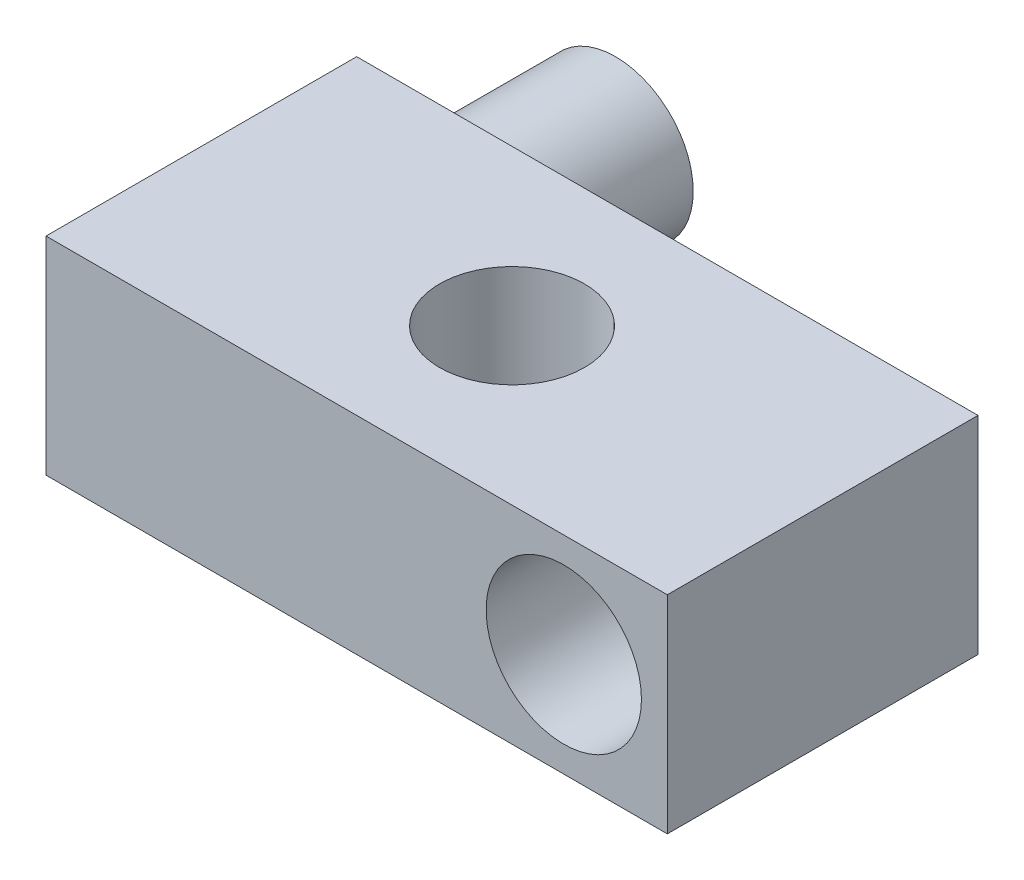
ISO-10303-21;
HEADER;
FILE_DESCRIPTION(('STEP AP214'),'2;1');
FILE_NAME('part.step','',(''),(''),'','','');
FILE_SCHEMA(('AUTOMOTIVE_DESIGN { 1 0 10303 214 1 1 1 1 }'));
ENDSEC;
DATA;
#1=APPLICATION_CONTEXT('core data for automotive mechanical design processes');
#2=APPLICATION_PROTOCOL_DEFINITION('international standard','automotive_design',2000,#1);
#3=PRODUCT_CONTEXT('',#1,'mechanical');
#4=PRODUCT('Part','Part','',(#3));
#5=PRODUCT_RELATED_PRODUCT_CATEGORY('part','',(#4));
#6=PRODUCT_DEFINITION_FORMATION('','',#4);
#7=PRODUCT_DEFINITION_CONTEXT('part definition',#1,'design');
#8=PRODUCT_DEFINITION('design','',#6,#7);
#9=PRODUCT_DEFINITION_SHAPE('','',#8);
#10=(LENGTH_UNIT() NAMED_UNIT(*) SI_UNIT(.MILLI.,.METRE.));
#11=(NAMED_UNIT(*) PLANE_ANGLE_UNIT() SI_UNIT($,.RADIAN.));
#12=(NAMED_UNIT(*) SI_UNIT($,.STERADIAN.) SOLID_ANGLE_UNIT());
#13=UNCERTAINTY_MEASURE_WITH_UNIT(LENGTH_MEASURE(1.E-05),#10,'distance_accuracy_value','');
#14=(GEOMETRIC_REPRESENTATION_CONTEXT(3) GLOBAL_UNCERTAINTY_ASSIGNED_CONTEXT((#13)) GLOBAL_UNIT_ASSIGNED_CONTEXT((#10,
#11,#12)) REPRESENTATION_CONTEXT('',''));
#15=CARTESIAN_POINT('',(0.,0.,0.));
#16=DIRECTION('',(0.,0.,1.));
#17=DIRECTION('',(1.,0.,0.));
#18=AXIS2_PLACEMENT_3D('',#15,#16,#17);
#19=CARTESIAN_POINT('',(0.,0.,6.));
#20=DIRECTION('',(0.,0.,1.));
#21=DIRECTION('',(1.,0.,0.));
#22=AXIS2_PLACEMENT_3D('',#19,#20,#21);
#23=PLANE('',#22);
#24=DIRECTION('',(0.,1.,0.));
#25=VECTOR('',#24,1.);
#26=CARTESIAN_POINT('',(10.9581577268137,-1.50195153597229,6.));
#27=LINE('',#26,#25);
#28=CARTESIAN_POINT('',(10.9581577268137,-1.50195153597229,6.));
#29=VERTEX_POINT('',#28);
#30=CARTESIAN_POINT('',(10.9581577268137,2.49804846402771,6.));
#31=VERTEX_POINT('',#30);
#32=EDGE_CURVE('E86',#29,#31,#27,.T.);
#33=ORIENTED_EDGE('',*,*,#32,.T.);
#34=DIRECTION('',(-1.,0.,0.));
#35=VECTOR('',#34,1.);
#36=CARTESIAN_POINT('',(10.9581577268137,2.49804846402771,6.));
#37=LINE('',#36,#35);
#38=CARTESIAN_POINT('',(-1.04184227318631,2.49804846402771,6.));
#39=VERTEX_POINT('',#38);
#40=EDGE_CURVE('E81',#31,#39,#37,.T.);
#41=ORIENTED_EDGE('',*,*,#40,.T.);
#42=DIRECTION('',(0.,-1.,0.));
#43=VECTOR('',#42,1.);
#44=CARTESIAN_POINT('',(-1.04184227318631,-1.50195153597229,6.));
#45=LINE('',#44,#43);
#46=CARTESIAN_POINT('',(-1.04184227318631,-1.50195153597229,6.));
#47=VERTEX_POINT('',#46);
#48=EDGE_CURVE('E84',#39,#47,#45,.T.);
#49=ORIENTED_EDGE('',*,*,#48,.T.);
#50=DIRECTION('',(1.,0.,0.));
#51=VECTOR('',#50,1.);
#52=CARTESIAN_POINT('',(10.9581577268137,-1.50195153597229,6.));
#53=LINE('',#52,#51);
#54=EDGE_CURVE('E50',#47,#29,#53,.T.);
#55=ORIENTED_EDGE('',*,*,#54,.T.);
#56=EDGE_LOOP('',(#33,#41,#49,#55));
#57=FACE_BOUND('',#56,.T.);
#58=CARTESIAN_POINT('',(8.95815772681369,0.498048464027712,6.));
#59=DIRECTION('',(0.,0.,1.));
#60=DIRECTION('',(1.,0.,0.));
#61=AXIS2_PLACEMENT_3D('',#58,#59,#60);
#62=CIRCLE('',#61,1.5);
#63=CARTESIAN_POINT('',(10.4581577268137,0.498048464027712,6.));
#64=VERTEX_POINT('',#63);
#65=EDGE_CURVE('E103',#64,#64,#62,.T.);
#66=ORIENTED_EDGE('',*,*,#65,.F.);
#67=EDGE_LOOP('',(#66));
#68=FACE_BOUND('',#67,.T.);
#69=ADVANCED_FACE('F33',(#57,#68),#23,.T.);
#70=CARTESIAN_POINT('',(0.,0.,0.));
#71=DIRECTION('',(0.,0.,1.));
#72=DIRECTION('',(1.,0.,0.));
#73=AXIS2_PLACEMENT_3D('',#70,#71,#72);
#74=PLANE('',#73);
#75=CARTESIAN_POINT('',(0.958157726813694,0.498048464027711,0.));
#76=DIRECTION('',(0.,0.,1.));
#77=DIRECTION('',(1.,0.,0.));
#78=AXIS2_PLACEMENT_3D('',#75,#76,#77);
#79=CIRCLE('',#78,1.5);
#80=CARTESIAN_POINT('',(2.45815772681369,0.498048464027711,0.));
#81=VERTEX_POINT('',#80);
#82=EDGE_CURVE('E11',#81,#81,#79,.F.);
#83=ORIENTED_EDGE('',*,*,#82,.F.);
#84=EDGE_LOOP('',(#83));
#85=FACE_BOUND('',#84,.T.);
#86=DIRECTION('',(0.,1.,0.));
#87=VECTOR('',#86,1.);
#88=CARTESIAN_POINT('',(10.9581577268137,-1.50195153597229,0.));
#89=LINE('',#88,#87);
#90=CARTESIAN_POINT('',(10.9581577268137,-1.50195153597229,0.));
#91=VERTEX_POINT('',#90);
#92=CARTESIAN_POINT('',(10.9581577268137,2.49804846402771,0.));
#93=VERTEX_POINT('',#92);
#94=EDGE_CURVE('E100',#91,#93,#89,.T.);
#95=ORIENTED_EDGE('',*,*,#94,.F.);
#96=DIRECTION('',(1.,0.,0.));
#97=VECTOR('',#96,1.);
#98=CARTESIAN_POINT('',(10.9581577268137,-1.50195153597229,0.));
#99=LINE('',#98,#97);
#100=CARTESIAN_POINT('',(-1.04184227318631,-1.50195153597229,0.));
#101=VERTEX_POINT('',#100);
#102=EDGE_CURVE('E73',#101,#91,#99,.T.);
#103=ORIENTED_EDGE('',*,*,#102,.F.);
#104=DIRECTION('',(0.,-1.,0.));
#105=VECTOR('',#104,1.);
#106=CARTESIAN_POINT('',(-1.04184227318631,-1.50195153597229,0.));
#107=LINE('',#106,#105);
#108=CARTESIAN_POINT('',(-1.04184227318631,2.49804846402771,0.));
#109=VERTEX_POINT('',#108);
#110=EDGE_CURVE('E67',#109,#101,#107,.T.);
#111=ORIENTED_EDGE('',*,*,#110,.F.);
#112=DIRECTION('',(-1.,0.,0.));
#113=VECTOR('',#112,1.);
#114=CARTESIAN_POINT('',(10.9581577268137,2.49804846402771,0.));
#115=LINE('',#114,#113);
#116=EDGE_CURVE('E91',#93,#109,#115,.T.);
#117=ORIENTED_EDGE('',*,*,#116,.F.);
#118=EDGE_LOOP('',(#95,#103,#111,#117));
#119=FACE_BOUND('',#118,.T.);
#120=CARTESIAN_POINT('',(8.95815772681369,0.498048464027712,0.));
#121=DIRECTION('',(0.,0.,1.));
#122=DIRECTION('',(1.,0.,0.));
#123=AXIS2_PLACEMENT_3D('',#120,#121,#122);
#124=CIRCLE('',#123,1.5);
#125=CARTESIAN_POINT('',(10.4581577268137,0.498048464027712,0.));
#126=VERTEX_POINT('',#125);
#127=EDGE_CURVE('E118',#126,#126,#124,.T.);
#128=ORIENTED_EDGE('',*,*,#127,.T.);
#129=EDGE_LOOP('',(#128));
#130=FACE_BOUND('',#129,.T.);
#131=ADVANCED_FACE('F111',(#85,#119,#130),#74,.F.);
#132=CARTESIAN_POINT('',(10.9581577268137,-1.50195153597229,6.));
#133=DIRECTION('',(-1.,0.,0.));
#134=DIRECTION('',(0.,-1.,0.));
#135=AXIS2_PLACEMENT_3D('',#132,#133,#134);
#136=PLANE('',#135);
#137=ORIENTED_EDGE('',*,*,#94,.T.);
#138=DIRECTION('',(0.,0.,-1.));
#139=VECTOR('',#138,1.);
#140=CARTESIAN_POINT('',(10.9581577268137,2.49804846402771,6.));
#141=LINE('',#140,#139);
#142=EDGE_CURVE('E42',#31,#93,#141,.T.);
#143=ORIENTED_EDGE('',*,*,#142,.F.);
#144=ORIENTED_EDGE('',*,*,#32,.F.);
#145=DIRECTION('',(0.,0.,-1.));
#146=VECTOR('',#145,1.);
#147=CARTESIAN_POINT('',(10.9581577268137,-1.50195153597229,6.));
#148=LINE('',#147,#146);
#149=EDGE_CURVE('E96',#29,#91,#148,.T.);
#150=ORIENTED_EDGE('',*,*,#149,.T.);
#151=EDGE_LOOP('',(#137,#143,#144,#150));
#152=FACE_BOUND('',#151,.T.);
#153=ADVANCED_FACE('F35',(#152),#136,.F.);
#154=CARTESIAN_POINT('',(10.9581577268137,2.49804846402771,6.));
#155=DIRECTION('',(0.,-1.,0.));
#156=DIRECTION('',(1.,0.,0.));
#157=AXIS2_PLACEMENT_3D('',#154,#155,#156);
#158=PLANE('',#157);
#159=CARTESIAN_POINT('',(4.95815772681369,2.49804846402771,3.));
#160=DIRECTION('',(0.,-1.,0.));
#161=DIRECTION('',(1.,0.,0.));
#162=AXIS2_PLACEMENT_3D('',#159,#160,#161);
#163=CIRCLE('',#162,1.4);
#164=CARTESIAN_POINT('',(6.35815772681369,2.49804846402771,3.));
#165=VERTEX_POINT('',#164);
#166=EDGE_CURVE('E125',#165,#165,#163,.F.);
#167=ORIENTED_EDGE('',*,*,#166,.F.);
#168=EDGE_LOOP('',(#167));
#169=FACE_BOUND('',#168,.T.);
#170=ORIENTED_EDGE('',*,*,#116,.T.);
#171=DIRECTION('',(0.,0.,-1.));
#172=VECTOR('',#171,1.);
#173=CARTESIAN_POINT('',(-1.04184227318631,2.49804846402771,6.));
#174=LINE('',#173,#172);
#175=EDGE_CURVE('E89',#39,#109,#174,.T.);
#176=ORIENTED_EDGE('',*,*,#175,.F.);
#177=ORIENTED_EDGE('',*,*,#40,.F.);
#178=ORIENTED_EDGE('',*,*,#142,.T.);
#179=EDGE_LOOP('',(#170,#176,#177,#178));
#180=FACE_BOUND('',#179,.T.);
#181=ADVANCED_FACE('F90',(#169,#180),#158,.F.);
#182=CARTESIAN_POINT('',(-1.04184227318631,-1.50195153597229,6.));
#183=DIRECTION('',(1.,0.,0.));
#184=DIRECTION('',(0.,1.,0.));
#185=AXIS2_PLACEMENT_3D('',#182,#183,#184);
#186=PLANE('',#185);
#187=ORIENTED_EDGE('',*,*,#110,.T.);
#188=DIRECTION('',(0.,0.,-1.));
#189=VECTOR('',#188,1.);
#190=CARTESIAN_POINT('',(-1.04184227318631,-1.50195153597229,6.));
#191=LINE('',#190,#189);
#192=EDGE_CURVE('E92',#47,#101,#191,.T.);
#193=ORIENTED_EDGE('',*,*,#192,.F.);
#194=ORIENTED_EDGE('',*,*,#48,.F.);
#195=ORIENTED_EDGE('',*,*,#175,.T.);
#196=EDGE_LOOP('',(#187,#193,#194,#195));
#197=FACE_BOUND('',#196,.T.);
#198=ADVANCED_FACE('F94',(#197),#186,.F.);
#199=CARTESIAN_POINT('',(10.9581577268137,-1.50195153597229,6.));
#200=DIRECTION('',(0.,1.,0.));
#201=DIRECTION('',(-1.,0.,0.));
#202=AXIS2_PLACEMENT_3D('',#199,#200,#201);
#203=PLANE('',#202);
#204=CARTESIAN_POINT('',(4.95815772681369,-1.50195153597229,3.));
#205=DIRECTION('',(0.,-1.,0.));
#206=DIRECTION('',(1.,0.,0.));
#207=AXIS2_PLACEMENT_3D('',#204,#205,#206);
#208=CIRCLE('',#207,1.4);
#209=CARTESIAN_POINT('',(6.35815772681369,-1.50195153597229,3.));
#210=VERTEX_POINT('',#209);
#211=EDGE_CURVE('E130',#210,#210,#208,.T.);
#212=ORIENTED_EDGE('',*,*,#211,.F.);
#213=EDGE_LOOP('',(#212));
#214=FACE_BOUND('',#213,.T.);
#215=ORIENTED_EDGE('',*,*,#102,.T.);
#216=ORIENTED_EDGE('',*,*,#149,.F.);
#217=ORIENTED_EDGE('',*,*,#54,.F.);
#218=ORIENTED_EDGE('',*,*,#192,.T.);
#219=EDGE_LOOP('',(#215,#216,#217,#218));
#220=FACE_BOUND('',#219,.T.);
#221=ADVANCED_FACE('F137',(#214,#220),#203,.F.);
#222=CARTESIAN_POINT('',(8.95815772681369,0.498048464027712,6.));
#223=DIRECTION('',(0.,0.,-1.));
#224=DIRECTION('',(-1.,0.,0.));
#225=AXIS2_PLACEMENT_3D('',#222,#223,#224);
#226=CYLINDRICAL_SURFACE('',#225,1.5);
#227=ORIENTED_EDGE('',*,*,#65,.T.);
#228=EDGE_LOOP('',(#227));
#229=FACE_BOUND('',#228,.T.);
#230=ORIENTED_EDGE('',*,*,#127,.F.);
#231=EDGE_LOOP('',(#230));
#232=FACE_BOUND('',#231,.T.);
#233=ADVANCED_FACE('F139',(#229,#232),#226,.F.);
#234=CARTESIAN_POINT('',(0.958157726813694,0.498048464027711,-3.));
#235=DIRECTION('',(0.,0.,1.));
#236=DIRECTION('',(1.,0.,0.));
#237=AXIS2_PLACEMENT_3D('',#234,#235,#236);
#238=CYLINDRICAL_SURFACE('',#237,1.5);
#239=CARTESIAN_POINT('',(0.958157726813694,0.498048464027711,-3.));
#240=DIRECTION('',(0.,0.,-1.));
#241=DIRECTION('',(-1.,0.,0.));
#242=AXIS2_PLACEMENT_3D('',#239,#240,#241);
#243=CIRCLE('',#242,1.5);
#244=CARTESIAN_POINT('',(-0.541842273186306,0.498048464027711,-3.));
#245=VERTEX_POINT('',#244);
#246=EDGE_CURVE('E120',#245,#245,#243,.T.);
#247=ORIENTED_EDGE('',*,*,#246,.F.);
#248=EDGE_LOOP('',(#247));
#249=FACE_BOUND('',#248,.T.);
#250=ORIENTED_EDGE('',*,*,#82,.T.);
#251=EDGE_LOOP('',(#250));
#252=FACE_BOUND('',#251,.T.);
#253=ADVANCED_FACE('F145',(#249,#252),#238,.T.);
#254=CARTESIAN_POINT('',(0.958157726813694,0.498048464027711,-3.));
#255=DIRECTION('',(0.,0.,-1.));
#256=DIRECTION('',(-1.,0.,0.));
#257=AXIS2_PLACEMENT_3D('',#254,#255,#256);
#258=PLANE('',#257);
#259=ORIENTED_EDGE('',*,*,#246,.T.);
#260=EDGE_LOOP('',(#259));
#261=FACE_BOUND('',#260,.T.);
#262=ADVANCED_FACE('F156',(#261),#258,.T.);
#263=CARTESIAN_POINT('',(4.95815772681369,2.49904846402771,3.));
#264=DIRECTION('',(0.,-1.,0.));
#265=DIRECTION('',(1.,0.,0.));
#266=AXIS2_PLACEMENT_3D('',#263,#264,#265);
#267=CYLINDRICAL_SURFACE('',#266,1.4);
#268=ORIENTED_EDGE('',*,*,#211,.T.);
#269=EDGE_LOOP('',(#268));
#270=FACE_BOUND('',#269,.T.);
#271=ORIENTED_EDGE('',*,*,#166,.T.);
#272=EDGE_LOOP('',(#271));
#273=FACE_BOUND('',#272,.T.);
#274=ADVANCED_FACE('F134',(#270,#273),#267,.F.);
#275=CLOSED_SHELL('',(#69,#131,#153,#181,#198,#221,#233,#253,#262,#274));
#276=MANIFOLD_SOLID_BREP('B2',#275);
#277=ADVANCED_BREP_SHAPE_REPRESENTATION('',(#18,#276),#14);
#278=SHAPE_DEFINITION_REPRESENTATION(#9,#277);
ENDSEC;
END-ISO-10303-21;
